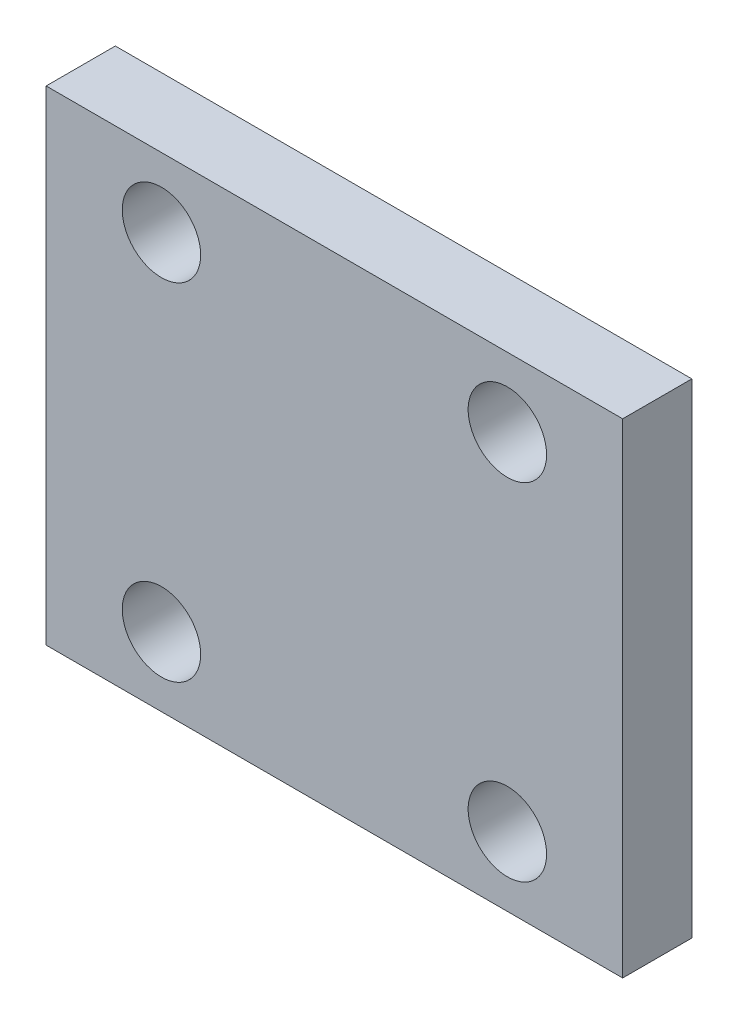
ISO-10303-21;
HEADER;
FILE_DESCRIPTION(('STEP AP214'),'2;1');
FILE_NAME('part.step','',(''),(''),'','','');
FILE_SCHEMA(('AUTOMOTIVE_DESIGN { 1 0 10303 214 1 1 1 1 }'));
ENDSEC;
DATA;
#1=APPLICATION_CONTEXT('core data for automotive mechanical design processes');
#2=APPLICATION_PROTOCOL_DEFINITION('international standard','automotive_design',2000,#1);
#3=PRODUCT_CONTEXT('',#1,'mechanical');
#4=PRODUCT('Part','Part','',(#3));
#5=PRODUCT_RELATED_PRODUCT_CATEGORY('part','',(#4));
#6=PRODUCT_DEFINITION_FORMATION('','',#4);
#7=PRODUCT_DEFINITION_CONTEXT('part definition',#1,'design');
#8=PRODUCT_DEFINITION('design','',#6,#7);
#9=PRODUCT_DEFINITION_SHAPE('','',#8);
#10=(LENGTH_UNIT() NAMED_UNIT(*) SI_UNIT(.MILLI.,.METRE.));
#11=(NAMED_UNIT(*) PLANE_ANGLE_UNIT() SI_UNIT($,.RADIAN.));
#12=(NAMED_UNIT(*) SI_UNIT($,.STERADIAN.) SOLID_ANGLE_UNIT());
#13=UNCERTAINTY_MEASURE_WITH_UNIT(LENGTH_MEASURE(1.E-05),#10,'distance_accuracy_value','');
#14=(GEOMETRIC_REPRESENTATION_CONTEXT(3) GLOBAL_UNCERTAINTY_ASSIGNED_CONTEXT((#13)) GLOBAL_UNIT_ASSIGNED_CONTEXT((#10,
#11,#12)) REPRESENTATION_CONTEXT('',''));
#15=CARTESIAN_POINT('',(0.,0.,0.));
#16=DIRECTION('',(0.,0.,1.));
#17=DIRECTION('',(1.,0.,0.));
#18=AXIS2_PLACEMENT_3D('',#15,#16,#17);
#19=CARTESIAN_POINT('',(0.,0.,3.));
#20=DIRECTION('',(1.,0.,0.));
#21=DIRECTION('',(0.,0.,-1.));
#22=AXIS2_PLACEMENT_3D('',#19,#20,#21);
#23=PLANE('',#22);
#24=DIRECTION('',(0.,-1.,0.));
#25=VECTOR('',#24,1.);
#26=CARTESIAN_POINT('',(0.,0.,0.));
#27=LINE('',#26,#25);
#28=CARTESIAN_POINT('',(0.,21.,0.));
#29=VERTEX_POINT('',#28);
#30=CARTESIAN_POINT('',(0.,0.,0.));
#31=VERTEX_POINT('',#30);
#32=EDGE_CURVE('E104',#29,#31,#27,.T.);
#33=ORIENTED_EDGE('',*,*,#32,.T.);
#34=DIRECTION('',(0.,0.,-1.));
#35=VECTOR('',#34,1.);
#36=CARTESIAN_POINT('',(0.,0.,3.));
#37=LINE('',#36,#35);
#38=CARTESIAN_POINT('',(0.,0.,3.));
#39=VERTEX_POINT('',#38);
#40=EDGE_CURVE('E11',#39,#31,#37,.T.);
#41=ORIENTED_EDGE('',*,*,#40,.F.);
#42=DIRECTION('',(0.,-1.,0.));
#43=VECTOR('',#42,1.);
#44=CARTESIAN_POINT('',(0.,0.,3.));
#45=LINE('',#44,#43);
#46=CARTESIAN_POINT('',(0.,21.,3.));
#47=VERTEX_POINT('',#46);
#48=EDGE_CURVE('E92',#47,#39,#45,.T.);
#49=ORIENTED_EDGE('',*,*,#48,.F.);
#50=DIRECTION('',(0.,0.,-1.));
#51=VECTOR('',#50,1.);
#52=CARTESIAN_POINT('',(0.,21.,3.));
#53=LINE('',#52,#51);
#54=EDGE_CURVE('E100',#47,#29,#53,.T.);
#55=ORIENTED_EDGE('',*,*,#54,.T.);
#56=EDGE_LOOP('',(#33,#41,#49,#55));
#57=FACE_BOUND('',#56,.T.);
#58=ADVANCED_FACE('F41',(#57),#23,.F.);
#59=CARTESIAN_POINT('',(0.,0.,3.));
#60=DIRECTION('',(0.,1.,0.));
#61=DIRECTION('',(0.,0.,1.));
#62=AXIS2_PLACEMENT_3D('',#59,#60,#61);
#63=PLANE('',#62);
#64=DIRECTION('',(1.,0.,0.));
#65=VECTOR('',#64,1.);
#66=CARTESIAN_POINT('',(0.,0.,0.));
#67=LINE('',#66,#65);
#68=CARTESIAN_POINT('',(25.,0.,0.));
#69=VERTEX_POINT('',#68);
#70=EDGE_CURVE('E96',#31,#69,#67,.T.);
#71=ORIENTED_EDGE('',*,*,#70,.T.);
#72=DIRECTION('',(0.,0.,-1.));
#73=VECTOR('',#72,1.);
#74=CARTESIAN_POINT('',(25.,0.,3.));
#75=LINE('',#74,#73);
#76=CARTESIAN_POINT('',(25.,0.,3.));
#77=VERTEX_POINT('',#76);
#78=EDGE_CURVE('E49',#77,#69,#75,.T.);
#79=ORIENTED_EDGE('',*,*,#78,.F.);
#80=DIRECTION('',(1.,0.,0.));
#81=VECTOR('',#80,1.);
#82=CARTESIAN_POINT('',(0.,0.,3.));
#83=LINE('',#82,#81);
#84=EDGE_CURVE('E87',#39,#77,#83,.T.);
#85=ORIENTED_EDGE('',*,*,#84,.F.);
#86=ORIENTED_EDGE('',*,*,#40,.T.);
#87=EDGE_LOOP('',(#71,#79,#85,#86));
#88=FACE_BOUND('',#87,.T.);
#89=ADVANCED_FACE('F95',(#88),#63,.F.);
#90=CARTESIAN_POINT('',(25.,0.,3.));
#91=DIRECTION('',(-1.,0.,0.));
#92=DIRECTION('',(0.,0.,1.));
#93=AXIS2_PLACEMENT_3D('',#90,#91,#92);
#94=PLANE('',#93);
#95=DIRECTION('',(0.,1.,0.));
#96=VECTOR('',#95,1.);
#97=CARTESIAN_POINT('',(25.,0.,0.));
#98=LINE('',#97,#96);
#99=CARTESIAN_POINT('',(25.,21.,0.));
#100=VERTEX_POINT('',#99);
#101=EDGE_CURVE('E74',#69,#100,#98,.T.);
#102=ORIENTED_EDGE('',*,*,#101,.T.);
#103=DIRECTION('',(0.,0.,-1.));
#104=VECTOR('',#103,1.);
#105=CARTESIAN_POINT('',(25.,21.,3.));
#106=LINE('',#105,#104);
#107=CARTESIAN_POINT('',(25.,21.,3.));
#108=VERTEX_POINT('',#107);
#109=EDGE_CURVE('E97',#108,#100,#106,.T.);
#110=ORIENTED_EDGE('',*,*,#109,.F.);
#111=DIRECTION('',(0.,1.,0.));
#112=VECTOR('',#111,1.);
#113=CARTESIAN_POINT('',(25.,0.,3.));
#114=LINE('',#113,#112);
#115=EDGE_CURVE('E90',#77,#108,#114,.T.);
#116=ORIENTED_EDGE('',*,*,#115,.F.);
#117=ORIENTED_EDGE('',*,*,#78,.T.);
#118=EDGE_LOOP('',(#102,#110,#116,#117));
#119=FACE_BOUND('',#118,.T.);
#120=ADVANCED_FACE('F98',(#119),#94,.F.);
#121=CARTESIAN_POINT('',(0.,21.,3.));
#122=DIRECTION('',(0.,-1.,0.));
#123=DIRECTION('',(0.,0.,-1.));
#124=AXIS2_PLACEMENT_3D('',#121,#122,#123);
#125=PLANE('',#124);
#126=DIRECTION('',(-1.,0.,0.));
#127=VECTOR('',#126,1.);
#128=CARTESIAN_POINT('',(0.,21.,0.));
#129=LINE('',#128,#127);
#130=EDGE_CURVE('E80',#100,#29,#129,.T.);
#131=ORIENTED_EDGE('',*,*,#130,.T.);
#132=ORIENTED_EDGE('',*,*,#54,.F.);
#133=DIRECTION('',(-1.,0.,0.));
#134=VECTOR('',#133,1.);
#135=CARTESIAN_POINT('',(0.,21.,3.));
#136=LINE('',#135,#134);
#137=EDGE_CURVE('E57',#108,#47,#136,.T.);
#138=ORIENTED_EDGE('',*,*,#137,.F.);
#139=ORIENTED_EDGE('',*,*,#109,.T.);
#140=EDGE_LOOP('',(#131,#132,#138,#139));
#141=FACE_BOUND('',#140,.T.);
#142=ADVANCED_FACE('F112',(#141),#125,.F.);
#143=CARTESIAN_POINT('',(0.,0.,3.));
#144=DIRECTION('',(0.,0.,-1.));
#145=DIRECTION('',(-1.,0.,0.));
#146=AXIS2_PLACEMENT_3D('',#143,#144,#145);
#147=PLANE('',#146);
#148=CARTESIAN_POINT('',(20.,18.,3.));
#149=DIRECTION('',(0.,0.,1.));
#150=DIRECTION('',(1.,0.,0.));
#151=AXIS2_PLACEMENT_3D('',#148,#149,#150);
#152=CIRCLE('',#151,1.7);
#153=CARTESIAN_POINT('',(21.7,18.,3.));
#154=VERTEX_POINT('',#153);
#155=EDGE_CURVE('E131',#154,#154,#152,.T.);
#156=ORIENTED_EDGE('',*,*,#155,.F.);
#157=EDGE_LOOP('',(#156));
#158=FACE_BOUND('',#157,.T.);
#159=CARTESIAN_POINT('',(5.,3.,3.));
#160=DIRECTION('',(0.,0.,1.));
#161=DIRECTION('',(1.,0.,0.));
#162=AXIS2_PLACEMENT_3D('',#159,#160,#161);
#163=CIRCLE('',#162,1.7);
#164=CARTESIAN_POINT('',(6.7,3.,3.));
#165=VERTEX_POINT('',#164);
#166=EDGE_CURVE('E124',#165,#165,#163,.T.);
#167=ORIENTED_EDGE('',*,*,#166,.F.);
#168=EDGE_LOOP('',(#167));
#169=FACE_BOUND('',#168,.T.);
#170=CARTESIAN_POINT('',(20.,3.,3.));
#171=DIRECTION('',(0.,0.,1.));
#172=DIRECTION('',(1.,0.,0.));
#173=AXIS2_PLACEMENT_3D('',#170,#171,#172);
#174=CIRCLE('',#173,1.7);
#175=CARTESIAN_POINT('',(21.7,3.,3.));
#176=VERTEX_POINT('',#175);
#177=EDGE_CURVE('E136',#176,#176,#174,.T.);
#178=ORIENTED_EDGE('',*,*,#177,.F.);
#179=EDGE_LOOP('',(#178));
#180=FACE_BOUND('',#179,.T.);
#181=CARTESIAN_POINT('',(5.,18.,3.));
#182=DIRECTION('',(0.,0.,1.));
#183=DIRECTION('',(1.,0.,0.));
#184=AXIS2_PLACEMENT_3D('',#181,#182,#183);
#185=CIRCLE('',#184,1.7);
#186=CARTESIAN_POINT('',(6.7,18.,3.));
#187=VERTEX_POINT('',#186);
#188=EDGE_CURVE('E107',#187,#187,#185,.T.);
#189=ORIENTED_EDGE('',*,*,#188,.F.);
#190=EDGE_LOOP('',(#189));
#191=FACE_BOUND('',#190,.T.);
#192=ORIENTED_EDGE('',*,*,#48,.T.);
#193=ORIENTED_EDGE('',*,*,#84,.T.);
#194=ORIENTED_EDGE('',*,*,#115,.T.);
#195=ORIENTED_EDGE('',*,*,#137,.T.);
#196=EDGE_LOOP('',(#192,#193,#194,#195));
#197=FACE_BOUND('',#196,.T.);
#198=ADVANCED_FACE('F88',(#158,#169,#180,#191,#197),#147,.F.);
#199=CARTESIAN_POINT('',(0.,0.,0.));
#200=DIRECTION('',(0.,0.,-1.));
#201=DIRECTION('',(-1.,0.,0.));
#202=AXIS2_PLACEMENT_3D('',#199,#200,#201);
#203=PLANE('',#202);
#204=CARTESIAN_POINT('',(20.,18.,0.));
#205=DIRECTION('',(0.,0.,-1.));
#206=DIRECTION('',(-1.,0.,0.));
#207=AXIS2_PLACEMENT_3D('',#204,#205,#206);
#208=CIRCLE('',#207,1.7);
#209=CARTESIAN_POINT('',(21.7,18.,0.));
#210=VERTEX_POINT('',#209);
#211=EDGE_CURVE('E121',#210,#210,#208,.F.);
#212=ORIENTED_EDGE('',*,*,#211,.T.);
#213=EDGE_LOOP('',(#212));
#214=FACE_BOUND('',#213,.T.);
#215=CARTESIAN_POINT('',(5.,3.,0.));
#216=DIRECTION('',(0.,0.,-1.));
#217=DIRECTION('',(-1.,0.,0.));
#218=AXIS2_PLACEMENT_3D('',#215,#216,#217);
#219=CIRCLE('',#218,1.7);
#220=CARTESIAN_POINT('',(6.7,3.,0.));
#221=VERTEX_POINT('',#220);
#222=EDGE_CURVE('E127',#221,#221,#219,.F.);
#223=ORIENTED_EDGE('',*,*,#222,.T.);
#224=EDGE_LOOP('',(#223));
#225=FACE_BOUND('',#224,.T.);
#226=CARTESIAN_POINT('',(20.,3.,0.));
#227=DIRECTION('',(0.,0.,-1.));
#228=DIRECTION('',(-1.,0.,0.));
#229=AXIS2_PLACEMENT_3D('',#226,#227,#228);
#230=CIRCLE('',#229,1.7);
#231=CARTESIAN_POINT('',(21.7,3.,0.));
#232=VERTEX_POINT('',#231);
#233=EDGE_CURVE('E128',#232,#232,#230,.F.);
#234=ORIENTED_EDGE('',*,*,#233,.T.);
#235=EDGE_LOOP('',(#234));
#236=FACE_BOUND('',#235,.T.);
#237=CARTESIAN_POINT('',(5.,18.,0.));
#238=DIRECTION('',(0.,0.,-1.));
#239=DIRECTION('',(-1.,0.,0.));
#240=AXIS2_PLACEMENT_3D('',#237,#238,#239);
#241=CIRCLE('',#240,1.7);
#242=CARTESIAN_POINT('',(6.7,18.,0.));
#243=VERTEX_POINT('',#242);
#244=EDGE_CURVE('E118',#243,#243,#241,.F.);
#245=ORIENTED_EDGE('',*,*,#244,.T.);
#246=EDGE_LOOP('',(#245));
#247=FACE_BOUND('',#246,.T.);
#248=ORIENTED_EDGE('',*,*,#32,.F.);
#249=ORIENTED_EDGE('',*,*,#130,.F.);
#250=ORIENTED_EDGE('',*,*,#101,.F.);
#251=ORIENTED_EDGE('',*,*,#70,.F.);
#252=EDGE_LOOP('',(#248,#249,#250,#251));
#253=FACE_BOUND('',#252,.T.);
#254=ADVANCED_FACE('F115',(#214,#225,#236,#247,#253),#203,.T.);
#255=CARTESIAN_POINT('',(5.,18.,-0.00100000000000013));
#256=DIRECTION('',(0.,0.,1.));
#257=DIRECTION('',(1.,0.,0.));
#258=AXIS2_PLACEMENT_3D('',#255,#256,#257);
#259=CYLINDRICAL_SURFACE('',#258,1.7);
#260=CARTESIAN_POINT('',(6.7,18.,0.));
#261=CARTESIAN_POINT('',(6.7,18.,0.03125));
#262=CARTESIAN_POINT('',(6.7,18.,0.0625));
#263=CARTESIAN_POINT('',(6.7,18.,0.125));
#264=CARTESIAN_POINT('',(6.7,18.,0.15625));
#265=CARTESIAN_POINT('',(6.7,18.,0.21875));
#266=CARTESIAN_POINT('',(6.7,18.,0.25));
#267=CARTESIAN_POINT('',(6.7,18.,0.3125));
#268=CARTESIAN_POINT('',(6.7,18.,0.34375));
#269=CARTESIAN_POINT('',(6.7,18.,0.40625));
#270=CARTESIAN_POINT('',(6.7,18.,0.4375));
#271=CARTESIAN_POINT('',(6.7,18.,0.5));
#272=CARTESIAN_POINT('',(6.7,18.,0.53125));
#273=CARTESIAN_POINT('',(6.7,18.,0.59375));
#274=CARTESIAN_POINT('',(6.7,18.,0.625));
#275=CARTESIAN_POINT('',(6.7,18.,0.6875));
#276=CARTESIAN_POINT('',(6.7,18.,0.71875));
#277=CARTESIAN_POINT('',(6.7,18.,0.78125));
#278=CARTESIAN_POINT('',(6.7,18.,0.8125));
#279=CARTESIAN_POINT('',(6.7,18.,0.875));
#280=CARTESIAN_POINT('',(6.7,18.,0.90625));
#281=CARTESIAN_POINT('',(6.7,18.,0.96875));
#282=CARTESIAN_POINT('',(6.7,18.,1.));
#283=CARTESIAN_POINT('',(6.7,18.,1.0625));
#284=CARTESIAN_POINT('',(6.7,18.,1.09375));
#285=CARTESIAN_POINT('',(6.7,18.,1.15625));
#286=CARTESIAN_POINT('',(6.7,18.,1.1875));
#287=CARTESIAN_POINT('',(6.7,18.,1.25));
#288=CARTESIAN_POINT('',(6.7,18.,1.28125));
#289=CARTESIAN_POINT('',(6.7,18.,1.34375));
#290=CARTESIAN_POINT('',(6.7,18.,1.375));
#291=CARTESIAN_POINT('',(6.7,18.,1.4375));
#292=CARTESIAN_POINT('',(6.7,18.,1.46875));
#293=CARTESIAN_POINT('',(6.7,18.,1.53125));
#294=CARTESIAN_POINT('',(6.7,18.,1.5625));
#295=CARTESIAN_POINT('',(6.7,18.,1.625));
#296=CARTESIAN_POINT('',(6.7,18.,1.65625));
#297=CARTESIAN_POINT('',(6.7,18.,1.71875));
#298=CARTESIAN_POINT('',(6.7,18.,1.75));
#299=CARTESIAN_POINT('',(6.7,18.,1.8125));
#300=CARTESIAN_POINT('',(6.7,18.,1.84375));
#301=CARTESIAN_POINT('',(6.7,18.,1.90625));
#302=CARTESIAN_POINT('',(6.7,18.,1.9375));
#303=CARTESIAN_POINT('',(6.7,18.,2.));
#304=CARTESIAN_POINT('',(6.7,18.,2.03125));
#305=CARTESIAN_POINT('',(6.7,18.,2.09375));
#306=CARTESIAN_POINT('',(6.7,18.,2.125));
#307=CARTESIAN_POINT('',(6.7,18.,2.1875));
#308=CARTESIAN_POINT('',(6.7,18.,2.21875));
#309=CARTESIAN_POINT('',(6.7,18.,2.28125));
#310=CARTESIAN_POINT('',(6.7,18.,2.3125));
#311=CARTESIAN_POINT('',(6.7,18.,2.375));
#312=CARTESIAN_POINT('',(6.7,18.,2.40625));
#313=CARTESIAN_POINT('',(6.7,18.,2.46875));
#314=CARTESIAN_POINT('',(6.7,18.,2.5));
#315=CARTESIAN_POINT('',(6.7,18.,2.5625));
#316=CARTESIAN_POINT('',(6.7,18.,2.59375));
#317=CARTESIAN_POINT('',(6.7,18.,2.65625));
#318=CARTESIAN_POINT('',(6.7,18.,2.6875));
#319=CARTESIAN_POINT('',(6.7,18.,2.75));
#320=CARTESIAN_POINT('',(6.7,18.,2.78125));
#321=CARTESIAN_POINT('',(6.7,18.,2.84375));
#322=CARTESIAN_POINT('',(6.7,18.,2.875));
#323=CARTESIAN_POINT('',(6.7,18.,2.9375));
#324=CARTESIAN_POINT('',(6.7,18.,2.96875));
#325=CARTESIAN_POINT('',(6.7,18.,3.));
#326=B_SPLINE_CURVE_WITH_KNOTS('',3,(#260,#261,#262,#263,#264,#265,#266,#267,#268,#269,#270,
#271,#272,#273,#274,#275,#276,#277,#278,#279,#280,#281,#282,#283,#284,#285,#286,#287,#288,#289,
#290,#291,#292,#293,#294,#295,#296,#297,#298,#299,#300,#301,#302,#303,#304,#305,#306,#307,#308,
#309,#310,#311,#312,#313,#314,#315,#316,#317,#318,#319,#320,#321,#322,#323,#324,#325),
.UNSPECIFIED.,.F.,.F.,(4,2,2,2,2,2,2,2,2,2,2,2,2,2,2,2,2,2,2,2,2,2,2,2,2,2,2,2,2,2,2,2,4),(0.,
0.09375,0.1875,0.28125,0.375,0.46875,0.5625,0.65625,0.75,0.84375,0.9375,1.03125,1.125,1.21875,
1.3125,1.40625,1.5,1.59375,1.6875,1.78125,1.875,1.96875,2.0625,2.15625,2.25,2.34375,2.4375,
2.53125,2.625,2.71875,2.8125,2.90625,3.),.UNSPECIFIED.);
#327=EDGE_CURVE('BSEAM148',#243,#187,#326,.T.);
#328=ORIENTED_EDGE('',*,*,#244,.F.);
#329=ORIENTED_EDGE('',*,*,#188,.T.);
#330=ORIENTED_EDGE('',*,*,#327,.T.);
#331=ORIENTED_EDGE('',*,*,#327,.F.);
#332=EDGE_LOOP('',(#328,#330,#329,#331));
#333=FACE_BOUND('',#332,.T.);
#334=ADVANCED_FACE('F148',(#333),#259,.F.);
#335=CARTESIAN_POINT('',(20.,3.,-0.00100000000000013));
#336=DIRECTION('',(0.,0.,1.));
#337=DIRECTION('',(1.,0.,0.));
#338=AXIS2_PLACEMENT_3D('',#335,#336,#337);
#339=CYLINDRICAL_SURFACE('',#338,1.7);
#340=CARTESIAN_POINT('',(21.7,3.,0.));
#341=CARTESIAN_POINT('',(21.7,3.,0.03125));
#342=CARTESIAN_POINT('',(21.7,3.,0.0625));
#343=CARTESIAN_POINT('',(21.7,3.,0.125));
#344=CARTESIAN_POINT('',(21.7,3.,0.15625));
#345=CARTESIAN_POINT('',(21.7,3.,0.21875));
#346=CARTESIAN_POINT('',(21.7,3.,0.25));
#347=CARTESIAN_POINT('',(21.7,3.,0.3125));
#348=CARTESIAN_POINT('',(21.7,3.,0.34375));
#349=CARTESIAN_POINT('',(21.7,3.,0.40625));
#350=CARTESIAN_POINT('',(21.7,3.,0.4375));
#351=CARTESIAN_POINT('',(21.7,3.,0.5));
#352=CARTESIAN_POINT('',(21.7,3.,0.53125));
#353=CARTESIAN_POINT('',(21.7,3.,0.59375));
#354=CARTESIAN_POINT('',(21.7,3.,0.625));
#355=CARTESIAN_POINT('',(21.7,3.,0.6875));
#356=CARTESIAN_POINT('',(21.7,3.,0.71875));
#357=CARTESIAN_POINT('',(21.7,3.,0.78125));
#358=CARTESIAN_POINT('',(21.7,3.,0.8125));
#359=CARTESIAN_POINT('',(21.7,3.,0.875));
#360=CARTESIAN_POINT('',(21.7,3.,0.90625));
#361=CARTESIAN_POINT('',(21.7,3.,0.96875));
#362=CARTESIAN_POINT('',(21.7,3.,1.));
#363=CARTESIAN_POINT('',(21.7,3.,1.0625));
#364=CARTESIAN_POINT('',(21.7,3.,1.09375));
#365=CARTESIAN_POINT('',(21.7,3.,1.15625));
#366=CARTESIAN_POINT('',(21.7,3.,1.1875));
#367=CARTESIAN_POINT('',(21.7,3.,1.25));
#368=CARTESIAN_POINT('',(21.7,3.,1.28125));
#369=CARTESIAN_POINT('',(21.7,3.,1.34375));
#370=CARTESIAN_POINT('',(21.7,3.,1.375));
#371=CARTESIAN_POINT('',(21.7,3.,1.4375));
#372=CARTESIAN_POINT('',(21.7,3.,1.46875));
#373=CARTESIAN_POINT('',(21.7,3.,1.53125));
#374=CARTESIAN_POINT('',(21.7,3.,1.5625));
#375=CARTESIAN_POINT('',(21.7,3.,1.625));
#376=CARTESIAN_POINT('',(21.7,3.,1.65625));
#377=CARTESIAN_POINT('',(21.7,3.,1.71875));
#378=CARTESIAN_POINT('',(21.7,3.,1.75));
#379=CARTESIAN_POINT('',(21.7,3.,1.8125));
#380=CARTESIAN_POINT('',(21.7,3.,1.84375));
#381=CARTESIAN_POINT('',(21.7,3.,1.90625));
#382=CARTESIAN_POINT('',(21.7,3.,1.9375));
#383=CARTESIAN_POINT('',(21.7,3.,2.));
#384=CARTESIAN_POINT('',(21.7,3.,2.03125));
#385=CARTESIAN_POINT('',(21.7,3.,2.09375));
#386=CARTESIAN_POINT('',(21.7,3.,2.125));
#387=CARTESIAN_POINT('',(21.7,3.,2.1875));
#388=CARTESIAN_POINT('',(21.7,3.,2.21875));
#389=CARTESIAN_POINT('',(21.7,3.,2.28125));
#390=CARTESIAN_POINT('',(21.7,3.,2.3125));
#391=CARTESIAN_POINT('',(21.7,3.,2.375));
#392=CARTESIAN_POINT('',(21.7,3.,2.40625));
#393=CARTESIAN_POINT('',(21.7,3.,2.46875));
#394=CARTESIAN_POINT('',(21.7,3.,2.5));
#395=CARTESIAN_POINT('',(21.7,3.,2.5625));
#396=CARTESIAN_POINT('',(21.7,3.,2.59375));
#397=CARTESIAN_POINT('',(21.7,3.,2.65625));
#398=CARTESIAN_POINT('',(21.7,3.,2.6875));
#399=CARTESIAN_POINT('',(21.7,3.,2.75));
#400=CARTESIAN_POINT('',(21.7,3.,2.78125));
#401=CARTESIAN_POINT('',(21.7,3.,2.84375));
#402=CARTESIAN_POINT('',(21.7,3.,2.875));
#403=CARTESIAN_POINT('',(21.7,3.,2.9375));
#404=CARTESIAN_POINT('',(21.7,3.,2.96875));
#405=CARTESIAN_POINT('',(21.7,3.,3.));
#406=B_SPLINE_CURVE_WITH_KNOTS('',3,(#340,#341,#342,#343,#344,#345,#346,#347,#348,#349,#350,
#351,#352,#353,#354,#355,#356,#357,#358,#359,#360,#361,#362,#363,#364,#365,#366,#367,#368,#369,
#370,#371,#372,#373,#374,#375,#376,#377,#378,#379,#380,#381,#382,#383,#384,#385,#386,#387,#388,
#389,#390,#391,#392,#393,#394,#395,#396,#397,#398,#399,#400,#401,#402,#403,#404,#405),
.UNSPECIFIED.,.F.,.F.,(4,2,2,2,2,2,2,2,2,2,2,2,2,2,2,2,2,2,2,2,2,2,2,2,2,2,2,2,2,2,2,2,4),(0.,
0.09375,0.1875,0.28125,0.375,0.46875,0.5625,0.65625,0.75,0.84375,0.9375,1.03125,1.125,1.21875,
1.3125,1.40625,1.5,1.59375,1.6875,1.78125,1.875,1.96875,2.0625,2.15625,2.25,2.34375,2.4375,
2.53125,2.625,2.71875,2.8125,2.90625,3.),.UNSPECIFIED.);
#407=EDGE_CURVE('BSEAM144',#232,#176,#406,.T.);
#408=ORIENTED_EDGE('',*,*,#233,.F.);
#409=ORIENTED_EDGE('',*,*,#177,.T.);
#410=ORIENTED_EDGE('',*,*,#407,.T.);
#411=ORIENTED_EDGE('',*,*,#407,.F.);
#412=EDGE_LOOP('',(#408,#410,#409,#411));
#413=FACE_BOUND('',#412,.T.);
#414=ADVANCED_FACE('F144',(#413),#339,.F.);
#415=CARTESIAN_POINT('',(5.,3.,-0.00100000000000013));
#416=DIRECTION('',(0.,0.,1.));
#417=DIRECTION('',(1.,0.,0.));
#418=AXIS2_PLACEMENT_3D('',#415,#416,#417);
#419=CYLINDRICAL_SURFACE('',#418,1.7);
#420=CARTESIAN_POINT('',(6.7,3.,0.));
#421=CARTESIAN_POINT('',(6.7,3.,0.03125));
#422=CARTESIAN_POINT('',(6.7,3.,0.0625));
#423=CARTESIAN_POINT('',(6.7,3.,0.125));
#424=CARTESIAN_POINT('',(6.7,3.,0.15625));
#425=CARTESIAN_POINT('',(6.7,3.,0.21875));
#426=CARTESIAN_POINT('',(6.7,3.,0.25));
#427=CARTESIAN_POINT('',(6.7,3.,0.3125));
#428=CARTESIAN_POINT('',(6.7,3.,0.34375));
#429=CARTESIAN_POINT('',(6.7,3.,0.40625));
#430=CARTESIAN_POINT('',(6.7,3.,0.4375));
#431=CARTESIAN_POINT('',(6.7,3.,0.5));
#432=CARTESIAN_POINT('',(6.7,3.,0.53125));
#433=CARTESIAN_POINT('',(6.7,3.,0.59375));
#434=CARTESIAN_POINT('',(6.7,3.,0.625));
#435=CARTESIAN_POINT('',(6.7,3.,0.6875));
#436=CARTESIAN_POINT('',(6.7,3.,0.71875));
#437=CARTESIAN_POINT('',(6.7,3.,0.78125));
#438=CARTESIAN_POINT('',(6.7,3.,0.8125));
#439=CARTESIAN_POINT('',(6.7,3.,0.875));
#440=CARTESIAN_POINT('',(6.7,3.,0.90625));
#441=CARTESIAN_POINT('',(6.7,3.,0.96875));
#442=CARTESIAN_POINT('',(6.7,3.,1.));
#443=CARTESIAN_POINT('',(6.7,3.,1.0625));
#444=CARTESIAN_POINT('',(6.7,3.,1.09375));
#445=CARTESIAN_POINT('',(6.7,3.,1.15625));
#446=CARTESIAN_POINT('',(6.7,3.,1.1875));
#447=CARTESIAN_POINT('',(6.7,3.,1.25));
#448=CARTESIAN_POINT('',(6.7,3.,1.28125));
#449=CARTESIAN_POINT('',(6.7,3.,1.34375));
#450=CARTESIAN_POINT('',(6.7,3.,1.375));
#451=CARTESIAN_POINT('',(6.7,3.,1.4375));
#452=CARTESIAN_POINT('',(6.7,3.,1.46875));
#453=CARTESIAN_POINT('',(6.7,3.,1.53125));
#454=CARTESIAN_POINT('',(6.7,3.,1.5625));
#455=CARTESIAN_POINT('',(6.7,3.,1.625));
#456=CARTESIAN_POINT('',(6.7,3.,1.65625));
#457=CARTESIAN_POINT('',(6.7,3.,1.71875));
#458=CARTESIAN_POINT('',(6.7,3.,1.75));
#459=CARTESIAN_POINT('',(6.7,3.,1.8125));
#460=CARTESIAN_POINT('',(6.7,3.,1.84375));
#461=CARTESIAN_POINT('',(6.7,3.,1.90625));
#462=CARTESIAN_POINT('',(6.7,3.,1.9375));
#463=CARTESIAN_POINT('',(6.7,3.,2.));
#464=CARTESIAN_POINT('',(6.7,3.,2.03125));
#465=CARTESIAN_POINT('',(6.7,3.,2.09375));
#466=CARTESIAN_POINT('',(6.7,3.,2.125));
#467=CARTESIAN_POINT('',(6.7,3.,2.1875));
#468=CARTESIAN_POINT('',(6.7,3.,2.21875));
#469=CARTESIAN_POINT('',(6.7,3.,2.28125));
#470=CARTESIAN_POINT('',(6.7,3.,2.3125));
#471=CARTESIAN_POINT('',(6.7,3.,2.375));
#472=CARTESIAN_POINT('',(6.7,3.,2.40625));
#473=CARTESIAN_POINT('',(6.7,3.,2.46875));
#474=CARTESIAN_POINT('',(6.7,3.,2.5));
#475=CARTESIAN_POINT('',(6.7,3.,2.5625));
#476=CARTESIAN_POINT('',(6.7,3.,2.59375));
#477=CARTESIAN_POINT('',(6.7,3.,2.65625));
#478=CARTESIAN_POINT('',(6.7,3.,2.6875));
#479=CARTESIAN_POINT('',(6.7,3.,2.75));
#480=CARTESIAN_POINT('',(6.7,3.,2.78125));
#481=CARTESIAN_POINT('',(6.7,3.,2.84375));
#482=CARTESIAN_POINT('',(6.7,3.,2.875));
#483=CARTESIAN_POINT('',(6.7,3.,2.9375));
#484=CARTESIAN_POINT('',(6.7,3.,2.96875));
#485=CARTESIAN_POINT('',(6.7,3.,3.));
#486=B_SPLINE_CURVE_WITH_KNOTS('',3,(#420,#421,#422,#423,#424,#425,#426,#427,#428,#429,#430,
#431,#432,#433,#434,#435,#436,#437,#438,#439,#440,#441,#442,#443,#444,#445,#446,#447,#448,#449,
#450,#451,#452,#453,#454,#455,#456,#457,#458,#459,#460,#461,#462,#463,#464,#465,#466,#467,#468,
#469,#470,#471,#472,#473,#474,#475,#476,#477,#478,#479,#480,#481,#482,#483,#484,#485),
.UNSPECIFIED.,.F.,.F.,(4,2,2,2,2,2,2,2,2,2,2,2,2,2,2,2,2,2,2,2,2,2,2,2,2,2,2,2,2,2,2,2,4),(0.,
0.09375,0.1875,0.28125,0.375,0.46875,0.5625,0.65625,0.75,0.84375,0.9375,1.03125,1.125,1.21875,
1.3125,1.40625,1.5,1.59375,1.6875,1.78125,1.875,1.96875,2.0625,2.15625,2.25,2.34375,2.4375,
2.53125,2.625,2.71875,2.8125,2.90625,3.),.UNSPECIFIED.);
#487=EDGE_CURVE('BSEAM147',#221,#165,#486,.T.);
#488=ORIENTED_EDGE('',*,*,#222,.F.);
#489=ORIENTED_EDGE('',*,*,#166,.T.);
#490=ORIENTED_EDGE('',*,*,#487,.T.);
#491=ORIENTED_EDGE('',*,*,#487,.F.);
#492=EDGE_LOOP('',(#488,#490,#489,#491));
#493=FACE_BOUND('',#492,.T.);
#494=ADVANCED_FACE('F147',(#493),#419,.F.);
#495=CARTESIAN_POINT('',(20.,18.,-0.00100000000000013));
#496=DIRECTION('',(0.,0.,1.));
#497=DIRECTION('',(1.,0.,0.));
#498=AXIS2_PLACEMENT_3D('',#495,#496,#497);
#499=CYLINDRICAL_SURFACE('',#498,1.7);
#500=CARTESIAN_POINT('',(21.7,18.,0.));
#501=CARTESIAN_POINT('',(21.7,18.,0.03125));
#502=CARTESIAN_POINT('',(21.7,18.,0.0625));
#503=CARTESIAN_POINT('',(21.7,18.,0.125));
#504=CARTESIAN_POINT('',(21.7,18.,0.15625));
#505=CARTESIAN_POINT('',(21.7,18.,0.21875));
#506=CARTESIAN_POINT('',(21.7,18.,0.25));
#507=CARTESIAN_POINT('',(21.7,18.,0.3125));
#508=CARTESIAN_POINT('',(21.7,18.,0.34375));
#509=CARTESIAN_POINT('',(21.7,18.,0.40625));
#510=CARTESIAN_POINT('',(21.7,18.,0.4375));
#511=CARTESIAN_POINT('',(21.7,18.,0.5));
#512=CARTESIAN_POINT('',(21.7,18.,0.53125));
#513=CARTESIAN_POINT('',(21.7,18.,0.59375));
#514=CARTESIAN_POINT('',(21.7,18.,0.625));
#515=CARTESIAN_POINT('',(21.7,18.,0.6875));
#516=CARTESIAN_POINT('',(21.7,18.,0.71875));
#517=CARTESIAN_POINT('',(21.7,18.,0.78125));
#518=CARTESIAN_POINT('',(21.7,18.,0.8125));
#519=CARTESIAN_POINT('',(21.7,18.,0.875));
#520=CARTESIAN_POINT('',(21.7,18.,0.90625));
#521=CARTESIAN_POINT('',(21.7,18.,0.96875));
#522=CARTESIAN_POINT('',(21.7,18.,1.));
#523=CARTESIAN_POINT('',(21.7,18.,1.0625));
#524=CARTESIAN_POINT('',(21.7,18.,1.09375));
#525=CARTESIAN_POINT('',(21.7,18.,1.15625));
#526=CARTESIAN_POINT('',(21.7,18.,1.1875));
#527=CARTESIAN_POINT('',(21.7,18.,1.25));
#528=CARTESIAN_POINT('',(21.7,18.,1.28125));
#529=CARTESIAN_POINT('',(21.7,18.,1.34375));
#530=CARTESIAN_POINT('',(21.7,18.,1.375));
#531=CARTESIAN_POINT('',(21.7,18.,1.4375));
#532=CARTESIAN_POINT('',(21.7,18.,1.46875));
#533=CARTESIAN_POINT('',(21.7,18.,1.53125));
#534=CARTESIAN_POINT('',(21.7,18.,1.5625));
#535=CARTESIAN_POINT('',(21.7,18.,1.625));
#536=CARTESIAN_POINT('',(21.7,18.,1.65625));
#537=CARTESIAN_POINT('',(21.7,18.,1.71875));
#538=CARTESIAN_POINT('',(21.7,18.,1.75));
#539=CARTESIAN_POINT('',(21.7,18.,1.8125));
#540=CARTESIAN_POINT('',(21.7,18.,1.84375));
#541=CARTESIAN_POINT('',(21.7,18.,1.90625));
#542=CARTESIAN_POINT('',(21.7,18.,1.9375));
#543=CARTESIAN_POINT('',(21.7,18.,2.));
#544=CARTESIAN_POINT('',(21.7,18.,2.03125));
#545=CARTESIAN_POINT('',(21.7,18.,2.09375));
#546=CARTESIAN_POINT('',(21.7,18.,2.125));
#547=CARTESIAN_POINT('',(21.7,18.,2.1875));
#548=CARTESIAN_POINT('',(21.7,18.,2.21875));
#549=CARTESIAN_POINT('',(21.7,18.,2.28125));
#550=CARTESIAN_POINT('',(21.7,18.,2.3125));
#551=CARTESIAN_POINT('',(21.7,18.,2.375));
#552=CARTESIAN_POINT('',(21.7,18.,2.40625));
#553=CARTESIAN_POINT('',(21.7,18.,2.46875));
#554=CARTESIAN_POINT('',(21.7,18.,2.5));
#555=CARTESIAN_POINT('',(21.7,18.,2.5625));
#556=CARTESIAN_POINT('',(21.7,18.,2.59375));
#557=CARTESIAN_POINT('',(21.7,18.,2.65625));
#558=CARTESIAN_POINT('',(21.7,18.,2.6875));
#559=CARTESIAN_POINT('',(21.7,18.,2.75));
#560=CARTESIAN_POINT('',(21.7,18.,2.78125));
#561=CARTESIAN_POINT('',(21.7,18.,2.84375));
#562=CARTESIAN_POINT('',(21.7,18.,2.875));
#563=CARTESIAN_POINT('',(21.7,18.,2.9375));
#564=CARTESIAN_POINT('',(21.7,18.,2.96875));
#565=CARTESIAN_POINT('',(21.7,18.,3.));
#566=B_SPLINE_CURVE_WITH_KNOTS('',3,(#500,#501,#502,#503,#504,#505,#506,#507,#508,#509,#510,
#511,#512,#513,#514,#515,#516,#517,#518,#519,#520,#521,#522,#523,#524,#525,#526,#527,#528,#529,
#530,#531,#532,#533,#534,#535,#536,#537,#538,#539,#540,#541,#542,#543,#544,#545,#546,#547,#548,
#549,#550,#551,#552,#553,#554,#555,#556,#557,#558,#559,#560,#561,#562,#563,#564,#565),
.UNSPECIFIED.,.F.,.F.,(4,2,2,2,2,2,2,2,2,2,2,2,2,2,2,2,2,2,2,2,2,2,2,2,2,2,2,2,2,2,2,2,4),(0.,
0.09375,0.1875,0.28125,0.375,0.46875,0.5625,0.65625,0.75,0.84375,0.9375,1.03125,1.125,1.21875,
1.3125,1.40625,1.5,1.59375,1.6875,1.78125,1.875,1.96875,2.0625,2.15625,2.25,2.34375,2.4375,
2.53125,2.625,2.71875,2.8125,2.90625,3.),.UNSPECIFIED.);
#567=EDGE_CURVE('BSEAM212',#210,#154,#566,.T.);
#568=ORIENTED_EDGE('',*,*,#211,.F.);
#569=ORIENTED_EDGE('',*,*,#155,.T.);
#570=ORIENTED_EDGE('',*,*,#567,.T.);
#571=ORIENTED_EDGE('',*,*,#567,.F.);
#572=EDGE_LOOP('',(#568,#570,#569,#571));
#573=FACE_BOUND('',#572,.T.);
#574=ADVANCED_FACE('F212',(#573),#499,.F.);
#575=CLOSED_SHELL('',(#58,#89,#120,#142,#198,#254,#334,#414,#494,#574));
#576=MANIFOLD_SOLID_BREP('B2',#575);
#577=ADVANCED_BREP_SHAPE_REPRESENTATION('',(#18,#576),#14);
#578=SHAPE_DEFINITION_REPRESENTATION(#9,#577);
ENDSEC;
END-ISO-10303-21;
